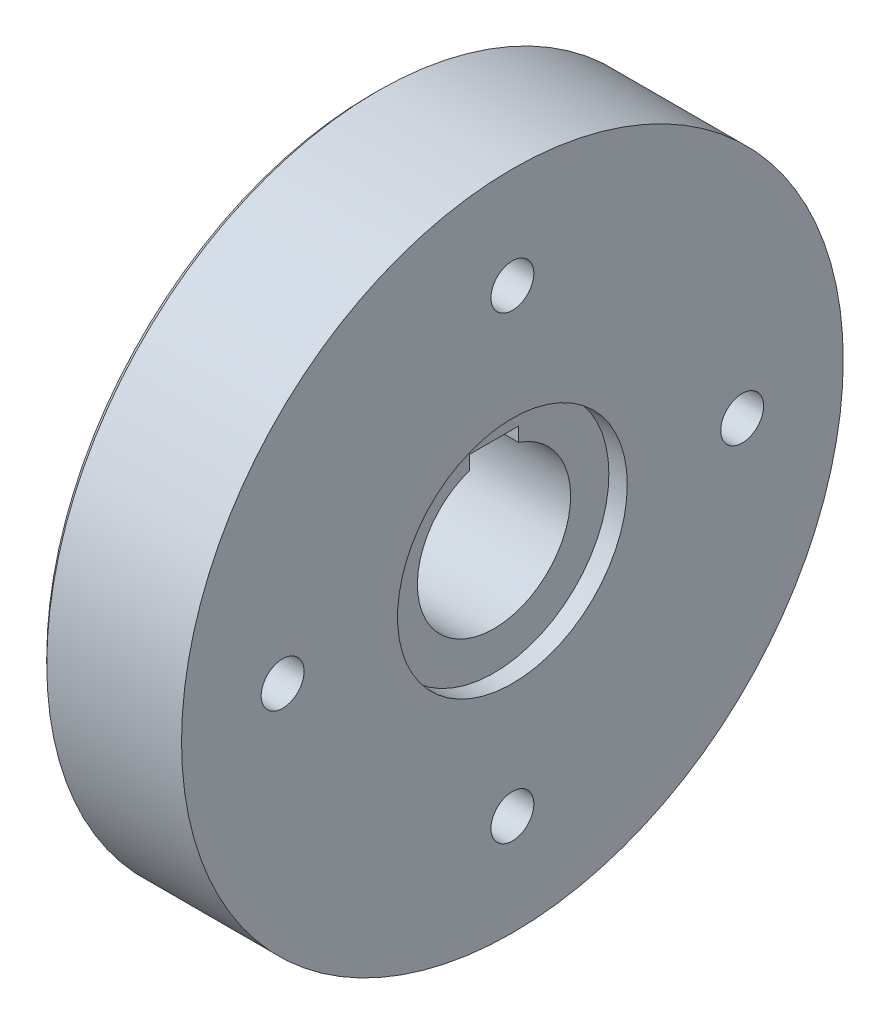
ISO-10303-21;
HEADER;
FILE_DESCRIPTION(('STEP AP214'),'2;1');
FILE_NAME('part.step','',(''),(''),'','','');
FILE_SCHEMA(('AUTOMOTIVE_DESIGN { 1 0 10303 214 1 1 1 1 }'));
ENDSEC;
DATA;
#1=APPLICATION_CONTEXT('core data for automotive mechanical design processes');
#2=APPLICATION_PROTOCOL_DEFINITION('international standard','automotive_design',2000,#1);
#3=PRODUCT_CONTEXT('',#1,'mechanical');
#4=PRODUCT('Part','Part','',(#3));
#5=PRODUCT_RELATED_PRODUCT_CATEGORY('part','',(#4));
#6=PRODUCT_DEFINITION_FORMATION('','',#4);
#7=PRODUCT_DEFINITION_CONTEXT('part definition',#1,'design');
#8=PRODUCT_DEFINITION('design','',#6,#7);
#9=PRODUCT_DEFINITION_SHAPE('','',#8);
#10=(LENGTH_UNIT() NAMED_UNIT(*) SI_UNIT(.MILLI.,.METRE.));
#11=(NAMED_UNIT(*) PLANE_ANGLE_UNIT() SI_UNIT($,.RADIAN.));
#12=(NAMED_UNIT(*) SI_UNIT($,.STERADIAN.) SOLID_ANGLE_UNIT());
#13=UNCERTAINTY_MEASURE_WITH_UNIT(LENGTH_MEASURE(1.E-05),#10,'distance_accuracy_value','');
#14=(GEOMETRIC_REPRESENTATION_CONTEXT(3) GLOBAL_UNCERTAINTY_ASSIGNED_CONTEXT((#13)) GLOBAL_UNIT_ASSIGNED_CONTEXT((#10,
#11,#12)) REPRESENTATION_CONTEXT('',''));
#15=CARTESIAN_POINT('',(0.,0.,0.));
#16=DIRECTION('',(0.,0.,1.));
#17=DIRECTION('',(1.,0.,0.));
#18=AXIS2_PLACEMENT_3D('',#15,#16,#17);
#19=CARTESIAN_POINT('',(-40.,0.,0.));
#20=DIRECTION('',(-1.,0.,0.));
#21=DIRECTION('',(0.,0.,1.));
#22=AXIS2_PLACEMENT_3D('',#19,#20,#21);
#23=CYLINDRICAL_SURFACE('',#22,25.);
#24=DIRECTION('',(-1.,0.,0.));
#25=VECTOR('',#24,1.);
#26=CARTESIAN_POINT('',(-40.,23.685438564654,8.));
#27=LINE('',#26,#25);
#28=CARTESIAN_POINT('',(-40.,23.685438564654,8.));
#29=VERTEX_POINT('',#28);
#30=CARTESIAN_POINT('',(34.,23.685438564654,8.));
#31=VERTEX_POINT('',#30);
#32=EDGE_CURVE('E73',#29,#31,#27,.F.);
#33=ORIENTED_EDGE('',*,*,#32,.T.);
#34=CARTESIAN_POINT('',(34.,0.,0.));
#35=DIRECTION('',(1.,0.,0.));
#36=DIRECTION('',(0.,0.,-1.));
#37=AXIS2_PLACEMENT_3D('',#34,#35,#36);
#38=CIRCLE('',#37,25.);
#39=CARTESIAN_POINT('',(34.,23.685438564654,-8.));
#40=VERTEX_POINT('',#39);
#41=EDGE_CURVE('E67',#31,#40,#38,.T.);
#42=ORIENTED_EDGE('',*,*,#41,.T.);
#43=DIRECTION('',(-1.,0.,0.));
#44=VECTOR('',#43,1.);
#45=CARTESIAN_POINT('',(-40.,23.685438564654,-8.));
#46=LINE('',#45,#44);
#47=CARTESIAN_POINT('',(-40.,23.685438564654,-8.));
#48=VERTEX_POINT('',#47);
#49=EDGE_CURVE('E122',#48,#40,#46,.F.);
#50=ORIENTED_EDGE('',*,*,#49,.F.);
#51=CARTESIAN_POINT('',(-40.,0.,0.));
#52=DIRECTION('',(-1.,0.,0.));
#53=DIRECTION('',(0.,0.,1.));
#54=AXIS2_PLACEMENT_3D('',#51,#52,#53);
#55=CIRCLE('',#54,25.);
#56=EDGE_CURVE('E156',#48,#29,#55,.T.);
#57=ORIENTED_EDGE('',*,*,#56,.T.);
#58=EDGE_LOOP('',(#33,#42,#50,#57));
#59=FACE_BOUND('',#58,.T.);
#60=ADVANCED_FACE('F50',(#59),#23,.F.);
#61=CARTESIAN_POINT('',(-40.,27.55,-8.));
#62=DIRECTION('',(-0.00999950003749684,0.999950003749688,0.));
#63=DIRECTION('',(-0.999950003749688,-0.00999950003749684,0.));
#64=AXIS2_PLACEMENT_3D('',#61,#62,#63);
#65=PLANE('',#64);
#66=DIRECTION('',(0.,0.,-1.));
#67=VECTOR('',#66,1.);
#68=CARTESIAN_POINT('',(34.,28.29,-8.));
#69=LINE('',#68,#67);
#70=CARTESIAN_POINT('',(34.,28.29,8.));
#71=VERTEX_POINT('',#70);
#72=CARTESIAN_POINT('',(34.,28.29,-8.));
#73=VERTEX_POINT('',#72);
#74=EDGE_CURVE('E92',#71,#73,#69,.T.);
#75=ORIENTED_EDGE('',*,*,#74,.F.);
#76=DIRECTION('',(-0.999950003749688,-0.00999950003749684,0.));
#77=VECTOR('',#76,1.);
#78=CARTESIAN_POINT('',(-40.,27.55,8.));
#79=LINE('',#78,#77);
#80=CARTESIAN_POINT('',(-40.,27.55,8.));
#81=VERTEX_POINT('',#80);
#82=EDGE_CURVE('E99',#71,#81,#79,.T.);
#83=ORIENTED_EDGE('',*,*,#82,.T.);
#84=DIRECTION('',(0.,0.,1.));
#85=VECTOR('',#84,1.);
#86=CARTESIAN_POINT('',(-40.,27.55,-8.));
#87=LINE('',#86,#85);
#88=CARTESIAN_POINT('',(-40.,27.55,-8.));
#89=VERTEX_POINT('',#88);
#90=EDGE_CURVE('E117',#89,#81,#87,.T.);
#91=ORIENTED_EDGE('',*,*,#90,.F.);
#92=DIRECTION('',(-0.999950003749688,-0.00999950003749684,0.));
#93=VECTOR('',#92,1.);
#94=CARTESIAN_POINT('',(-40.,27.55,-8.));
#95=LINE('',#94,#93);
#96=EDGE_CURVE('E100',#73,#89,#95,.T.);
#97=ORIENTED_EDGE('',*,*,#96,.F.);
#98=EDGE_LOOP('',(#75,#83,#91,#97));
#99=FACE_BOUND('',#98,.T.);
#100=ADVANCED_FACE('F97',(#99),#65,.F.);
#101=CARTESIAN_POINT('',(0.,0.,-8.));
#102=DIRECTION('',(0.,0.,-1.));
#103=DIRECTION('',(-1.,0.,0.));
#104=AXIS2_PLACEMENT_3D('',#101,#102,#103);
#105=PLANE('',#104);
#106=DIRECTION('',(0.,-1.,0.));
#107=VECTOR('',#106,1.);
#108=CARTESIAN_POINT('',(34.,0.,-8.));
#109=LINE('',#108,#107);
#110=EDGE_CURVE('E113',#73,#40,#109,.T.);
#111=ORIENTED_EDGE('',*,*,#110,.F.);
#112=ORIENTED_EDGE('',*,*,#96,.T.);
#113=DIRECTION('',(0.,-1.,0.));
#114=VECTOR('',#113,1.);
#115=CARTESIAN_POINT('',(-40.,0.,-8.));
#116=LINE('',#115,#114);
#117=EDGE_CURVE('E108',#89,#48,#116,.T.);
#118=ORIENTED_EDGE('',*,*,#117,.T.);
#119=ORIENTED_EDGE('',*,*,#49,.T.);
#120=EDGE_LOOP('',(#111,#112,#118,#119));
#121=FACE_BOUND('',#120,.T.);
#122=ADVANCED_FACE('F230',(#121),#105,.F.);
#123=CARTESIAN_POINT('',(0.,0.,8.));
#124=DIRECTION('',(0.,0.,-1.));
#125=DIRECTION('',(-1.,0.,0.));
#126=AXIS2_PLACEMENT_3D('',#123,#124,#125);
#127=PLANE('',#126);
#128=ORIENTED_EDGE('',*,*,#82,.F.);
#129=DIRECTION('',(0.,-1.,0.));
#130=VECTOR('',#129,1.);
#131=CARTESIAN_POINT('',(34.,0.,8.));
#132=LINE('',#131,#130);
#133=EDGE_CURVE('E11',#71,#31,#132,.T.);
#134=ORIENTED_EDGE('',*,*,#133,.T.);
#135=ORIENTED_EDGE('',*,*,#32,.F.);
#136=DIRECTION('',(0.,-1.,0.));
#137=VECTOR('',#136,1.);
#138=CARTESIAN_POINT('',(-40.,0.,8.));
#139=LINE('',#138,#137);
#140=EDGE_CURVE('E105',#81,#29,#139,.T.);
#141=ORIENTED_EDGE('',*,*,#140,.F.);
#142=EDGE_LOOP('',(#128,#134,#135,#141));
#143=FACE_BOUND('',#142,.T.);
#144=ADVANCED_FACE('F104',(#143),#127,.T.);
#145=CARTESIAN_POINT('',(15.,0.,0.));
#146=DIRECTION('',(1.,0.,0.));
#147=DIRECTION('',(0.,0.,-1.));
#148=AXIS2_PLACEMENT_3D('',#145,#146,#147);
#149=PLANE('',#148);
#150=CARTESIAN_POINT('',(15.,0.,0.));
#151=DIRECTION('',(1.,0.,0.));
#152=DIRECTION('',(0.,0.,-1.));
#153=AXIS2_PLACEMENT_3D('',#150,#151,#152);
#154=CIRCLE('',#153,52.);
#155=CARTESIAN_POINT('',(15.,0.,-52.));
#156=VERTEX_POINT('',#155);
#157=EDGE_CURVE('E182',#156,#156,#154,.T.);
#158=ORIENTED_EDGE('',*,*,#157,.T.);
#159=EDGE_LOOP('',(#158));
#160=FACE_BOUND('',#159,.T.);
#161=CARTESIAN_POINT('',(15.,0.,75.));
#162=DIRECTION('',(1.,0.,0.));
#163=DIRECTION('',(0.,0.,-1.));
#164=AXIS2_PLACEMENT_3D('',#161,#162,#163);
#165=CIRCLE('',#164,6.99999999999997);
#166=CARTESIAN_POINT('',(15.,0.,68.));
#167=VERTEX_POINT('',#166);
#168=EDGE_CURVE('E155',#167,#167,#165,.T.);
#169=ORIENTED_EDGE('',*,*,#168,.T.);
#170=EDGE_LOOP('',(#169));
#171=FACE_BOUND('',#170,.T.);
#172=CARTESIAN_POINT('',(15.,-75.,0.));
#173=DIRECTION('',(1.,0.,0.));
#174=DIRECTION('',(0.,0.,-1.));
#175=AXIS2_PLACEMENT_3D('',#172,#173,#174);
#176=CIRCLE('',#175,6.99999999999996);
#177=CARTESIAN_POINT('',(15.,-75.,-6.99999999999995));
#178=VERTEX_POINT('',#177);
#179=EDGE_CURVE('E150',#178,#178,#176,.T.);
#180=ORIENTED_EDGE('',*,*,#179,.T.);
#181=EDGE_LOOP('',(#180));
#182=FACE_BOUND('',#181,.T.);
#183=CARTESIAN_POINT('',(15.,0.,-75.));
#184=DIRECTION('',(1.,0.,0.));
#185=DIRECTION('',(0.,0.,-1.));
#186=AXIS2_PLACEMENT_3D('',#183,#184,#185);
#187=CIRCLE('',#186,6.99999999999997);
#188=CARTESIAN_POINT('',(15.,0.,-81.9999999999999));
#189=VERTEX_POINT('',#188);
#190=EDGE_CURVE('E142',#189,#189,#187,.T.);
#191=ORIENTED_EDGE('',*,*,#190,.T.);
#192=EDGE_LOOP('',(#191));
#193=FACE_BOUND('',#192,.T.);
#194=CARTESIAN_POINT('',(15.,75.,0.));
#195=DIRECTION('',(1.,0.,0.));
#196=DIRECTION('',(0.,0.,-1.));
#197=AXIS2_PLACEMENT_3D('',#194,#195,#196);
#198=CIRCLE('',#197,6.99999999999996);
#199=CARTESIAN_POINT('',(15.,75.,-6.99999999999996));
#200=VERTEX_POINT('',#199);
#201=EDGE_CURVE('E134',#200,#200,#198,.T.);
#202=ORIENTED_EDGE('',*,*,#201,.T.);
#203=EDGE_LOOP('',(#202));
#204=FACE_BOUND('',#203,.T.);
#205=CARTESIAN_POINT('',(15.,0.,0.));
#206=DIRECTION('',(1.,0.,0.));
#207=DIRECTION('',(0.,0.,-1.));
#208=AXIS2_PLACEMENT_3D('',#205,#206,#207);
#209=CIRCLE('',#208,100.);
#210=CARTESIAN_POINT('',(15.,0.,-100.));
#211=VERTEX_POINT('',#210);
#212=EDGE_CURVE('E164',#211,#211,#209,.T.);
#213=ORIENTED_EDGE('',*,*,#212,.F.);
#214=EDGE_LOOP('',(#213));
#215=FACE_BOUND('',#214,.T.);
#216=ADVANCED_FACE('F285',(#160,#171,#182,#193,#204,#215),#149,.F.);
#217=CARTESIAN_POINT('',(40.,0.,0.));
#218=DIRECTION('',(1.,0.,0.));
#219=DIRECTION('',(0.,0.,-1.));
#220=AXIS2_PLACEMENT_3D('',#217,#218,#219);
#221=PLANE('',#220);
#222=CARTESIAN_POINT('',(40.,75.,0.));
#223=DIRECTION('',(1.,0.,0.));
#224=DIRECTION('',(0.,0.,-1.));
#225=AXIS2_PLACEMENT_3D('',#222,#223,#224);
#226=CIRCLE('',#225,6.99999999999996);
#227=CARTESIAN_POINT('',(40.,75.,-6.99999999999996));
#228=VERTEX_POINT('',#227);
#229=EDGE_CURVE('E130',#228,#228,#226,.T.);
#230=ORIENTED_EDGE('',*,*,#229,.F.);
#231=EDGE_LOOP('',(#230));
#232=FACE_BOUND('',#231,.T.);
#233=CARTESIAN_POINT('',(40.,0.,-75.));
#234=DIRECTION('',(1.,0.,0.));
#235=DIRECTION('',(0.,0.,-1.));
#236=AXIS2_PLACEMENT_3D('',#233,#234,#235);
#237=CIRCLE('',#236,6.99999999999997);
#238=CARTESIAN_POINT('',(40.,0.,-81.9999999999999));
#239=VERTEX_POINT('',#238);
#240=EDGE_CURVE('E138',#239,#239,#237,.T.);
#241=ORIENTED_EDGE('',*,*,#240,.F.);
#242=EDGE_LOOP('',(#241));
#243=FACE_BOUND('',#242,.T.);
#244=CARTESIAN_POINT('',(40.,-75.,0.));
#245=DIRECTION('',(1.,0.,0.));
#246=DIRECTION('',(0.,0.,-1.));
#247=AXIS2_PLACEMENT_3D('',#244,#245,#246);
#248=CIRCLE('',#247,6.99999999999996);
#249=CARTESIAN_POINT('',(40.,-75.,-6.99999999999995));
#250=VERTEX_POINT('',#249);
#251=EDGE_CURVE('E146',#250,#250,#248,.T.);
#252=ORIENTED_EDGE('',*,*,#251,.F.);
#253=EDGE_LOOP('',(#252));
#254=FACE_BOUND('',#253,.T.);
#255=CARTESIAN_POINT('',(40.,0.,75.));
#256=DIRECTION('',(1.,0.,0.));
#257=DIRECTION('',(0.,0.,-1.));
#258=AXIS2_PLACEMENT_3D('',#255,#256,#257);
#259=CIRCLE('',#258,6.99999999999997);
#260=CARTESIAN_POINT('',(40.,0.,68.));
#261=VERTEX_POINT('',#260);
#262=EDGE_CURVE('E151',#261,#261,#259,.T.);
#263=ORIENTED_EDGE('',*,*,#262,.F.);
#264=EDGE_LOOP('',(#263));
#265=FACE_BOUND('',#264,.T.);
#266=CARTESIAN_POINT('',(40.,0.,0.));
#267=DIRECTION('',(1.,0.,0.));
#268=DIRECTION('',(0.,0.,-1.));
#269=AXIS2_PLACEMENT_3D('',#266,#267,#268);
#270=CIRCLE('',#269,37.5);
#271=CARTESIAN_POINT('',(40.,0.,-37.5));
#272=VERTEX_POINT('',#271);
#273=EDGE_CURVE('E102',#272,#272,#270,.T.);
#274=ORIENTED_EDGE('',*,*,#273,.F.);
#275=EDGE_LOOP('',(#274));
#276=FACE_BOUND('',#275,.T.);
#277=CARTESIAN_POINT('',(40.,0.,0.));
#278=DIRECTION('',(-1.,0.,0.));
#279=DIRECTION('',(0.,0.,1.));
#280=AXIS2_PLACEMENT_3D('',#277,#278,#279);
#281=CIRCLE('',#280,108.);
#282=CARTESIAN_POINT('',(40.,0.,108.));
#283=VERTEX_POINT('',#282);
#284=EDGE_CURVE('E160',#283,#283,#281,.T.);
#285=ORIENTED_EDGE('',*,*,#284,.F.);
#286=EDGE_LOOP('',(#285));
#287=FACE_BOUND('',#286,.T.);
#288=ADVANCED_FACE('F232',(#232,#243,#254,#265,#276,#287),#221,.T.);
#289=CARTESIAN_POINT('',(-40.,0.,0.));
#290=DIRECTION('',(-1.,0.,0.));
#291=DIRECTION('',(0.,0.,1.));
#292=AXIS2_PLACEMENT_3D('',#289,#290,#291);
#293=CYLINDRICAL_SURFACE('',#292,108.);
#294=CARTESIAN_POINT('',(-3.99999999999998,0.,0.));
#295=DIRECTION('',(1.,0.,0.));
#296=DIRECTION('',(0.,0.,-1.));
#297=AXIS2_PLACEMENT_3D('',#294,#295,#296);
#298=CIRCLE('',#297,108.);
#299=CARTESIAN_POINT('',(-3.99999999999998,0.,-108.));
#300=VERTEX_POINT('',#299);
#301=EDGE_CURVE('E60',#300,#300,#298,.T.);
#302=ORIENTED_EDGE('',*,*,#301,.T.);
#303=EDGE_LOOP('',(#302));
#304=FACE_BOUND('',#303,.T.);
#305=ORIENTED_EDGE('',*,*,#284,.T.);
#306=EDGE_LOOP('',(#305));
#307=FACE_BOUND('',#306,.T.);
#308=ADVANCED_FACE('F197',(#304,#307),#293,.T.);
#309=CARTESIAN_POINT('',(-40.,0.,0.));
#310=DIRECTION('',(-1.,0.,0.));
#311=DIRECTION('',(0.,0.,1.));
#312=AXIS2_PLACEMENT_3D('',#309,#310,#311);
#313=CYLINDRICAL_SURFACE('',#312,50.);
#314=CARTESIAN_POINT('',(12.9999999999999,0.,0.));
#315=DIRECTION('',(1.,0.,0.));
#316=DIRECTION('',(0.,0.,-1.));
#317=AXIS2_PLACEMENT_3D('',#314,#315,#316);
#318=CIRCLE('',#317,50.);
#319=CARTESIAN_POINT('',(12.9999999999999,0.,-50.));
#320=VERTEX_POINT('',#319);
#321=EDGE_CURVE('E178',#320,#320,#318,.F.);
#322=ORIENTED_EDGE('',*,*,#321,.T.);
#323=EDGE_LOOP('',(#322));
#324=FACE_BOUND('',#323,.T.);
#325=CARTESIAN_POINT('',(-38.0000000000001,0.,0.));
#326=DIRECTION('',(1.,0.,0.));
#327=DIRECTION('',(0.,0.,-1.));
#328=AXIS2_PLACEMENT_3D('',#325,#326,#327);
#329=CIRCLE('',#328,50.);
#330=CARTESIAN_POINT('',(-38.0000000000001,0.,-50.));
#331=VERTEX_POINT('',#330);
#332=EDGE_CURVE('E174',#331,#331,#329,.T.);
#333=ORIENTED_EDGE('',*,*,#332,.T.);
#334=EDGE_LOOP('',(#333));
#335=FACE_BOUND('',#334,.T.);
#336=ADVANCED_FACE('F252',(#324,#335),#313,.T.);
#337=CARTESIAN_POINT('',(-40.,0.,0.));
#338=DIRECTION('',(1.,0.,0.));
#339=DIRECTION('',(0.,0.,-1.));
#340=AXIS2_PLACEMENT_3D('',#337,#338,#339);
#341=PLANE('',#340);
#342=CARTESIAN_POINT('',(-40.,0.,0.));
#343=DIRECTION('',(1.,0.,0.));
#344=DIRECTION('',(0.,0.,-1.));
#345=AXIS2_PLACEMENT_3D('',#342,#343,#344);
#346=CIRCLE('',#345,48.0000000000001);
#347=CARTESIAN_POINT('',(-40.,0.,-48.0000000000001));
#348=VERTEX_POINT('',#347);
#349=EDGE_CURVE('E186',#348,#348,#346,.F.);
#350=ORIENTED_EDGE('',*,*,#349,.T.);
#351=EDGE_LOOP('',(#350));
#352=FACE_BOUND('',#351,.T.);
#353=ORIENTED_EDGE('',*,*,#56,.F.);
#354=ORIENTED_EDGE('',*,*,#117,.F.);
#355=ORIENTED_EDGE('',*,*,#90,.T.);
#356=ORIENTED_EDGE('',*,*,#140,.T.);
#357=EDGE_LOOP('',(#353,#354,#355,#356));
#358=FACE_BOUND('',#357,.T.);
#359=ADVANCED_FACE('F248',(#352,#358),#341,.F.);
#360=CARTESIAN_POINT('',(40.,0.,75.));
#361=DIRECTION('',(1.,0.,0.));
#362=DIRECTION('',(0.,0.,-1.));
#363=AXIS2_PLACEMENT_3D('',#360,#361,#362);
#364=CYLINDRICAL_SURFACE('',#363,6.99999999999997);
#365=ORIENTED_EDGE('',*,*,#262,.T.);
#366=EDGE_LOOP('',(#365));
#367=FACE_BOUND('',#366,.T.);
#368=ORIENTED_EDGE('',*,*,#168,.F.);
#369=EDGE_LOOP('',(#368));
#370=FACE_BOUND('',#369,.T.);
#371=ADVANCED_FACE('F251',(#367,#370),#364,.F.);
#372=CARTESIAN_POINT('',(40.,-75.,0.));
#373=DIRECTION('',(1.,0.,0.));
#374=DIRECTION('',(0.,0.,-1.));
#375=AXIS2_PLACEMENT_3D('',#372,#373,#374);
#376=CYLINDRICAL_SURFACE('',#375,6.99999999999996);
#377=ORIENTED_EDGE('',*,*,#251,.T.);
#378=EDGE_LOOP('',(#377));
#379=FACE_BOUND('',#378,.T.);
#380=ORIENTED_EDGE('',*,*,#179,.F.);
#381=EDGE_LOOP('',(#380));
#382=FACE_BOUND('',#381,.T.);
#383=ADVANCED_FACE('F319',(#379,#382),#376,.F.);
#384=CARTESIAN_POINT('',(40.,0.,-75.));
#385=DIRECTION('',(1.,0.,0.));
#386=DIRECTION('',(0.,0.,-1.));
#387=AXIS2_PLACEMENT_3D('',#384,#385,#386);
#388=CYLINDRICAL_SURFACE('',#387,6.99999999999997);
#389=ORIENTED_EDGE('',*,*,#240,.T.);
#390=EDGE_LOOP('',(#389));
#391=FACE_BOUND('',#390,.T.);
#392=ORIENTED_EDGE('',*,*,#190,.F.);
#393=EDGE_LOOP('',(#392));
#394=FACE_BOUND('',#393,.T.);
#395=ADVANCED_FACE('F328',(#391,#394),#388,.F.);
#396=CARTESIAN_POINT('',(40.,75.,0.));
#397=DIRECTION('',(1.,0.,0.));
#398=DIRECTION('',(0.,0.,-1.));
#399=AXIS2_PLACEMENT_3D('',#396,#397,#398);
#400=CYLINDRICAL_SURFACE('',#399,6.99999999999996);
#401=ORIENTED_EDGE('',*,*,#229,.T.);
#402=EDGE_LOOP('',(#401));
#403=FACE_BOUND('',#402,.T.);
#404=ORIENTED_EDGE('',*,*,#201,.F.);
#405=EDGE_LOOP('',(#404));
#406=FACE_BOUND('',#405,.T.);
#407=ADVANCED_FACE('F209',(#403,#406),#400,.F.);
#408=CARTESIAN_POINT('',(-5.99999999999998,108.,0.));
#409=DIRECTION('',(1.,0.,0.));
#410=DIRECTION('',(0.,0.,-1.));
#411=AXIS2_PLACEMENT_3D('',#408,#409,#410);
#412=PLANE('',#411);
#413=CARTESIAN_POINT('',(-5.99999999999998,0.,0.));
#414=DIRECTION('',(1.,0.,0.));
#415=DIRECTION('',(0.,0.,-1.));
#416=AXIS2_PLACEMENT_3D('',#413,#414,#415);
#417=CIRCLE('',#416,106.);
#418=CARTESIAN_POINT('',(-5.99999999999998,0.,-106.));
#419=VERTEX_POINT('',#418);
#420=EDGE_CURVE('E190',#419,#419,#417,.F.);
#421=ORIENTED_EDGE('',*,*,#420,.T.);
#422=EDGE_LOOP('',(#421));
#423=FACE_BOUND('',#422,.T.);
#424=CARTESIAN_POINT('',(-5.99999999999998,0.,0.));
#425=DIRECTION('',(-1.,0.,0.));
#426=DIRECTION('',(0.,0.,1.));
#427=AXIS2_PLACEMENT_3D('',#424,#425,#426);
#428=CIRCLE('',#427,100.);
#429=CARTESIAN_POINT('',(-5.99999999999998,0.,100.));
#430=VERTEX_POINT('',#429);
#431=EDGE_CURVE('E126',#430,#430,#428,.T.);
#432=ORIENTED_EDGE('',*,*,#431,.F.);
#433=EDGE_LOOP('',(#432));
#434=FACE_BOUND('',#433,.T.);
#435=ADVANCED_FACE('F205',(#423,#434),#412,.F.);
#436=CARTESIAN_POINT('',(0.,0.,0.));
#437=DIRECTION('',(-1.,0.,0.));
#438=DIRECTION('',(0.,0.,1.));
#439=AXIS2_PLACEMENT_3D('',#436,#437,#438);
#440=CYLINDRICAL_SURFACE('',#439,100.);
#441=ORIENTED_EDGE('',*,*,#212,.T.);
#442=EDGE_LOOP('',(#441));
#443=FACE_BOUND('',#442,.T.);
#444=ORIENTED_EDGE('',*,*,#431,.T.);
#445=EDGE_LOOP('',(#444));
#446=FACE_BOUND('',#445,.T.);
#447=ADVANCED_FACE('F208',(#443,#446),#440,.F.);
#448=CARTESIAN_POINT('',(12.9999999999999,0.,0.));
#449=DIRECTION('',(1.,0.,0.));
#450=DIRECTION('',(0.,0.,-1.));
#451=AXIS2_PLACEMENT_3D('',#448,#449,#450);
#452=CONICAL_SURFACE('',#451,50.,0.78539816339744);
#453=ORIENTED_EDGE('',*,*,#157,.F.);
#454=EDGE_LOOP('',(#453));
#455=FACE_BOUND('',#454,.T.);
#456=ORIENTED_EDGE('',*,*,#321,.F.);
#457=EDGE_LOOP('',(#456));
#458=FACE_BOUND('',#457,.T.);
#459=ADVANCED_FACE('F214',(#455,#458),#452,.T.);
#460=CARTESIAN_POINT('',(-40.,0.,0.));
#461=DIRECTION('',(1.,0.,0.));
#462=DIRECTION('',(0.,0.,-1.));
#463=AXIS2_PLACEMENT_3D('',#460,#461,#462);
#464=CONICAL_SURFACE('',#463,48.0000000000001,0.785398163397447);
#465=ORIENTED_EDGE('',*,*,#332,.F.);
#466=EDGE_LOOP('',(#465));
#467=FACE_BOUND('',#466,.T.);
#468=ORIENTED_EDGE('',*,*,#349,.F.);
#469=EDGE_LOOP('',(#468));
#470=FACE_BOUND('',#469,.T.);
#471=ADVANCED_FACE('F202',(#467,#470),#464,.T.);
#472=CARTESIAN_POINT('',(-5.99999999999998,0.,0.));
#473=DIRECTION('',(1.,0.,0.));
#474=DIRECTION('',(0.,0.,-1.));
#475=AXIS2_PLACEMENT_3D('',#472,#473,#474);
#476=CONICAL_SURFACE('',#475,106.,0.785398163397448);
#477=ORIENTED_EDGE('',*,*,#301,.F.);
#478=EDGE_LOOP('',(#477));
#479=FACE_BOUND('',#478,.T.);
#480=ORIENTED_EDGE('',*,*,#420,.F.);
#481=EDGE_LOOP('',(#480));
#482=FACE_BOUND('',#481,.T.);
#483=ADVANCED_FACE('F53',(#479,#482),#476,.T.);
#484=CARTESIAN_POINT('',(34.,0.,0.));
#485=DIRECTION('',(1.,0.,0.));
#486=DIRECTION('',(0.,0.,-1.));
#487=AXIS2_PLACEMENT_3D('',#484,#485,#486);
#488=PLANE('',#487);
#489=CARTESIAN_POINT('',(34.,0.,0.));
#490=DIRECTION('',(1.,0.,0.));
#491=DIRECTION('',(0.,0.,-1.));
#492=AXIS2_PLACEMENT_3D('',#489,#490,#491);
#493=CIRCLE('',#492,37.5);
#494=CARTESIAN_POINT('',(34.,0.,-37.5));
#495=VERTEX_POINT('',#494);
#496=EDGE_CURVE('E267',#495,#495,#493,.T.);
#497=ORIENTED_EDGE('',*,*,#496,.T.);
#498=EDGE_LOOP('',(#497));
#499=FACE_BOUND('',#498,.T.);
#500=ORIENTED_EDGE('',*,*,#110,.T.);
#501=ORIENTED_EDGE('',*,*,#41,.F.);
#502=ORIENTED_EDGE('',*,*,#133,.F.);
#503=ORIENTED_EDGE('',*,*,#74,.T.);
#504=EDGE_LOOP('',(#500,#501,#502,#503));
#505=FACE_BOUND('',#504,.T.);
#506=ADVANCED_FACE('F91',(#499,#505),#488,.T.);
#507=CARTESIAN_POINT('',(34.,0.,0.));
#508=DIRECTION('',(1.,0.,0.));
#509=DIRECTION('',(0.,0.,-1.));
#510=AXIS2_PLACEMENT_3D('',#507,#508,#509);
#511=CYLINDRICAL_SURFACE('',#510,37.5);
#512=ORIENTED_EDGE('',*,*,#273,.T.);
#513=EDGE_LOOP('',(#512));
#514=FACE_BOUND('',#513,.T.);
#515=ORIENTED_EDGE('',*,*,#496,.F.);
#516=EDGE_LOOP('',(#515));
#517=FACE_BOUND('',#516,.T.);
#518=ADVANCED_FACE('F273',(#514,#517),#511,.F.);
#519=CLOSED_SHELL('',(#60,#100,#122,#144,#216,#288,#308,#336,#359,#371,#383,#395,#407,#435,#447,
#459,#471,#483,#506,#518));
#520=MANIFOLD_SOLID_BREP('B2',#519);
#521=ADVANCED_BREP_SHAPE_REPRESENTATION('',(#18,#520),#14);
#522=SHAPE_DEFINITION_REPRESENTATION(#9,#521);
ENDSEC;
END-ISO-10303-21;
